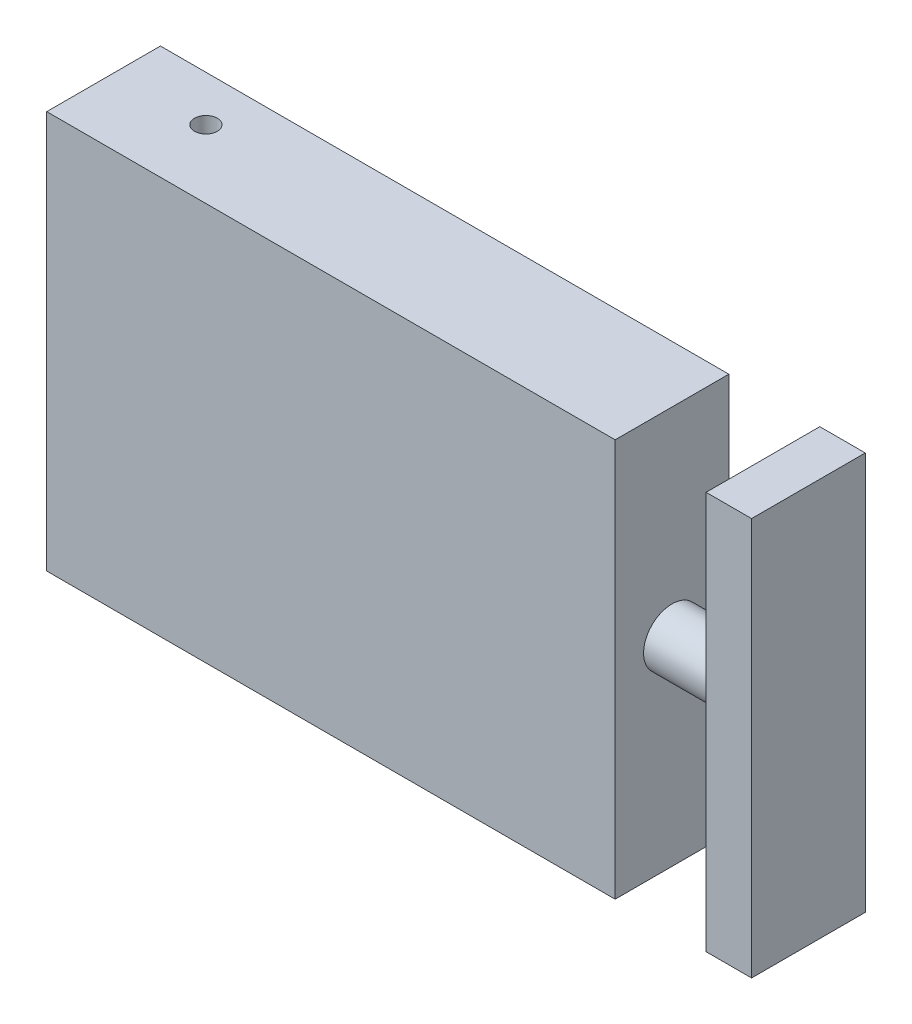
ISO-10303-21;
HEADER;
FILE_DESCRIPTION(('STEP AP214'),'2;1');
FILE_NAME('part.step','',(''),(''),'','','');
FILE_SCHEMA(('AUTOMOTIVE_DESIGN { 1 0 10303 214 1 1 1 1 }'));
ENDSEC;
DATA;
#1=APPLICATION_CONTEXT('core data for automotive mechanical design processes');
#2=APPLICATION_PROTOCOL_DEFINITION('international standard','automotive_design',2000,#1);
#3=PRODUCT_CONTEXT('',#1,'mechanical');
#4=PRODUCT('Part','Part','',(#3));
#5=PRODUCT_RELATED_PRODUCT_CATEGORY('part','',(#4));
#6=PRODUCT_DEFINITION_FORMATION('','',#4);
#7=PRODUCT_DEFINITION_CONTEXT('part definition',#1,'design');
#8=PRODUCT_DEFINITION('design','',#6,#7);
#9=PRODUCT_DEFINITION_SHAPE('','',#8);
#10=(LENGTH_UNIT() NAMED_UNIT(*) SI_UNIT(.MILLI.,.METRE.));
#11=(NAMED_UNIT(*) PLANE_ANGLE_UNIT() SI_UNIT($,.RADIAN.));
#12=(NAMED_UNIT(*) SI_UNIT($,.STERADIAN.) SOLID_ANGLE_UNIT());
#13=UNCERTAINTY_MEASURE_WITH_UNIT(LENGTH_MEASURE(1.E-05),#10,'distance_accuracy_value','');
#14=(GEOMETRIC_REPRESENTATION_CONTEXT(3) GLOBAL_UNCERTAINTY_ASSIGNED_CONTEXT((#13)) GLOBAL_UNIT_ASSIGNED_CONTEXT((#10,
#11,#12)) REPRESENTATION_CONTEXT('',''));
#15=CARTESIAN_POINT('',(0.,0.,0.));
#16=DIRECTION('',(0.,0.,1.));
#17=DIRECTION('',(1.,0.,0.));
#18=AXIS2_PLACEMENT_3D('',#15,#16,#17);
#19=CARTESIAN_POINT('',(0.,0.,100.));
#20=DIRECTION('',(1.,0.,0.));
#21=DIRECTION('',(0.,1.,0.));
#22=AXIS2_PLACEMENT_3D('',#19,#20,#21);
#23=PLANE('',#22);
#24=DIRECTION('',(0.,-1.,0.));
#25=VECTOR('',#24,1.);
#26=CARTESIAN_POINT('',(0.,0.,0.));
#27=LINE('',#26,#25);
#28=CARTESIAN_POINT('',(0.,0.,0.));
#29=VERTEX_POINT('',#28);
#30=CARTESIAN_POINT('',(0.,-350.,0.));
#31=VERTEX_POINT('',#30);
#32=EDGE_CURVE('E148',#29,#31,#27,.T.);
#33=ORIENTED_EDGE('',*,*,#32,.T.);
#34=DIRECTION('',(0.,0.,-1.));
#35=VECTOR('',#34,1.);
#36=CARTESIAN_POINT('',(0.,-350.,100.));
#37=LINE('',#36,#35);
#38=CARTESIAN_POINT('',(0.,-350.,100.));
#39=VERTEX_POINT('',#38);
#40=EDGE_CURVE('E169',#39,#31,#37,.T.);
#41=ORIENTED_EDGE('',*,*,#40,.F.);
#42=DIRECTION('',(0.,-1.,0.));
#43=VECTOR('',#42,1.);
#44=CARTESIAN_POINT('',(0.,0.,100.));
#45=LINE('',#44,#43);
#46=CARTESIAN_POINT('',(0.,0.,100.));
#47=VERTEX_POINT('',#46);
#48=EDGE_CURVE('E151',#47,#39,#45,.T.);
#49=ORIENTED_EDGE('',*,*,#48,.F.);
#50=DIRECTION('',(0.,0.,-1.));
#51=VECTOR('',#50,1.);
#52=CARTESIAN_POINT('',(0.,0.,100.));
#53=LINE('',#52,#51);
#54=EDGE_CURVE('E157',#47,#29,#53,.T.);
#55=ORIENTED_EDGE('',*,*,#54,.T.);
#56=EDGE_LOOP('',(#33,#41,#49,#55));
#57=FACE_BOUND('',#56,.T.);
#58=ADVANCED_FACE('F36',(#57),#23,.F.);
#59=CARTESIAN_POINT('',(0.,-350.,100.));
#60=DIRECTION('',(0.,1.,0.));
#61=DIRECTION('',(0.,0.,1.));
#62=AXIS2_PLACEMENT_3D('',#59,#60,#61);
#63=PLANE('',#62);
#64=CARTESIAN_POINT('',(80.,-350.,40.));
#65=DIRECTION('',(0.,-1.,0.));
#66=DIRECTION('',(0.,0.,-1.));
#67=AXIS2_PLACEMENT_3D('',#64,#65,#66);
#68=CIRCLE('',#67,10.);
#69=CARTESIAN_POINT('',(80.,-350.,30.));
#70=VERTEX_POINT('',#69);
#71=EDGE_CURVE('E139',#70,#70,#68,.T.);
#72=ORIENTED_EDGE('',*,*,#71,.F.);
#73=EDGE_LOOP('',(#72));
#74=FACE_BOUND('',#73,.T.);
#75=DIRECTION('',(1.,0.,0.));
#76=VECTOR('',#75,1.);
#77=CARTESIAN_POINT('',(0.,-350.,0.));
#78=LINE('',#77,#76);
#79=CARTESIAN_POINT('',(500.,-350.,0.));
#80=VERTEX_POINT('',#79);
#81=EDGE_CURVE('E160',#31,#80,#78,.T.);
#82=ORIENTED_EDGE('',*,*,#81,.T.);
#83=DIRECTION('',(0.,0.,-1.));
#84=VECTOR('',#83,1.);
#85=CARTESIAN_POINT('',(500.,-350.,100.));
#86=LINE('',#85,#84);
#87=CARTESIAN_POINT('',(500.,-350.,100.));
#88=VERTEX_POINT('',#87);
#89=EDGE_CURVE('E167',#88,#80,#86,.T.);
#90=ORIENTED_EDGE('',*,*,#89,.F.);
#91=DIRECTION('',(1.,0.,0.));
#92=VECTOR('',#91,1.);
#93=CARTESIAN_POINT('',(0.,-350.,100.));
#94=LINE('',#93,#92);
#95=EDGE_CURVE('E84',#39,#88,#94,.T.);
#96=ORIENTED_EDGE('',*,*,#95,.F.);
#97=ORIENTED_EDGE('',*,*,#40,.T.);
#98=EDGE_LOOP('',(#82,#90,#96,#97));
#99=FACE_BOUND('',#98,.T.);
#100=ADVANCED_FACE('F188',(#74,#99),#63,.F.);
#101=CARTESIAN_POINT('',(500.,0.,100.));
#102=DIRECTION('',(-1.,0.,0.));
#103=DIRECTION('',(0.,-1.,0.));
#104=AXIS2_PLACEMENT_3D('',#101,#102,#103);
#105=PLANE('',#104);
#106=CARTESIAN_POINT('',(500.,-175.,50.));
#107=DIRECTION('',(-1.,0.,0.));
#108=DIRECTION('',(0.,-1.,0.));
#109=AXIS2_PLACEMENT_3D('',#106,#107,#108);
#110=CIRCLE('',#109,25.);
#111=CARTESIAN_POINT('',(500.,-200.,50.));
#112=VERTEX_POINT('',#111);
#113=EDGE_CURVE('E11',#112,#112,#110,.F.);
#114=ORIENTED_EDGE('',*,*,#113,.F.);
#115=EDGE_LOOP('',(#114));
#116=FACE_BOUND('',#115,.T.);
#117=DIRECTION('',(0.,1.,0.));
#118=VECTOR('',#117,1.);
#119=CARTESIAN_POINT('',(500.,0.,0.));
#120=LINE('',#119,#118);
#121=CARTESIAN_POINT('',(500.,0.,0.));
#122=VERTEX_POINT('',#121);
#123=EDGE_CURVE('E70',#80,#122,#120,.T.);
#124=ORIENTED_EDGE('',*,*,#123,.T.);
#125=DIRECTION('',(0.,0.,-1.));
#126=VECTOR('',#125,1.);
#127=CARTESIAN_POINT('',(500.,0.,100.));
#128=LINE('',#127,#126);
#129=CARTESIAN_POINT('',(500.,0.,100.));
#130=VERTEX_POINT('',#129);
#131=EDGE_CURVE('E165',#130,#122,#128,.T.);
#132=ORIENTED_EDGE('',*,*,#131,.F.);
#133=DIRECTION('',(0.,1.,0.));
#134=VECTOR('',#133,1.);
#135=CARTESIAN_POINT('',(500.,0.,100.));
#136=LINE('',#135,#134);
#137=EDGE_CURVE('E154',#88,#130,#136,.T.);
#138=ORIENTED_EDGE('',*,*,#137,.F.);
#139=ORIENTED_EDGE('',*,*,#89,.T.);
#140=EDGE_LOOP('',(#124,#132,#138,#139));
#141=FACE_BOUND('',#140,.T.);
#142=ADVANCED_FACE('F187',(#116,#141),#105,.F.);
#143=CARTESIAN_POINT('',(0.,0.,100.));
#144=DIRECTION('',(0.,-1.,0.));
#145=DIRECTION('',(0.,0.,-1.));
#146=AXIS2_PLACEMENT_3D('',#143,#144,#145);
#147=PLANE('',#146);
#148=CARTESIAN_POINT('',(80.,0.,40.));
#149=DIRECTION('',(0.,-1.,0.));
#150=DIRECTION('',(0.,0.,-1.));
#151=AXIS2_PLACEMENT_3D('',#148,#149,#150);
#152=CIRCLE('',#151,10.);
#153=CARTESIAN_POINT('',(80.,0.,30.));
#154=VERTEX_POINT('',#153);
#155=EDGE_CURVE('E145',#154,#154,#152,.T.);
#156=ORIENTED_EDGE('',*,*,#155,.T.);
#157=EDGE_LOOP('',(#156));
#158=FACE_BOUND('',#157,.T.);
#159=DIRECTION('',(-1.,0.,0.));
#160=VECTOR('',#159,1.);
#161=CARTESIAN_POINT('',(0.,0.,0.));
#162=LINE('',#161,#160);
#163=EDGE_CURVE('E76',#122,#29,#162,.T.);
#164=ORIENTED_EDGE('',*,*,#163,.T.);
#165=ORIENTED_EDGE('',*,*,#54,.F.);
#166=DIRECTION('',(-1.,0.,0.));
#167=VECTOR('',#166,1.);
#168=CARTESIAN_POINT('',(0.,0.,100.));
#169=LINE('',#168,#167);
#170=EDGE_CURVE('E52',#130,#47,#169,.T.);
#171=ORIENTED_EDGE('',*,*,#170,.F.);
#172=ORIENTED_EDGE('',*,*,#131,.T.);
#173=EDGE_LOOP('',(#164,#165,#171,#172));
#174=FACE_BOUND('',#173,.T.);
#175=ADVANCED_FACE('F185',(#158,#174),#147,.F.);
#176=CARTESIAN_POINT('',(0.,0.,100.));
#177=DIRECTION('',(0.,0.,1.));
#178=DIRECTION('',(1.,0.,0.));
#179=AXIS2_PLACEMENT_3D('',#176,#177,#178);
#180=PLANE('',#179);
#181=ORIENTED_EDGE('',*,*,#48,.T.);
#182=ORIENTED_EDGE('',*,*,#95,.T.);
#183=ORIENTED_EDGE('',*,*,#137,.T.);
#184=ORIENTED_EDGE('',*,*,#170,.T.);
#185=EDGE_LOOP('',(#181,#182,#183,#184));
#186=FACE_BOUND('',#185,.T.);
#187=ADVANCED_FACE('F179',(#186),#180,.T.);
#188=CARTESIAN_POINT('',(0.,0.,0.));
#189=DIRECTION('',(0.,0.,1.));
#190=DIRECTION('',(1.,0.,0.));
#191=AXIS2_PLACEMENT_3D('',#188,#189,#190);
#192=PLANE('',#191);
#193=CARTESIAN_POINT('',(380.,-175.,0.));
#194=DIRECTION('',(0.,0.,1.));
#195=DIRECTION('',(1.,0.,0.));
#196=AXIS2_PLACEMENT_3D('',#193,#194,#195);
#197=CIRCLE('',#196,60.);
#198=CARTESIAN_POINT('',(440.,-175.,0.));
#199=VERTEX_POINT('',#198);
#200=EDGE_CURVE('E44',#199,#199,#197,.F.);
#201=ORIENTED_EDGE('',*,*,#200,.F.);
#202=EDGE_LOOP('',(#201));
#203=FACE_BOUND('',#202,.T.);
#204=ORIENTED_EDGE('',*,*,#32,.F.);
#205=ORIENTED_EDGE('',*,*,#163,.F.);
#206=ORIENTED_EDGE('',*,*,#123,.F.);
#207=ORIENTED_EDGE('',*,*,#81,.F.);
#208=EDGE_LOOP('',(#204,#205,#206,#207));
#209=FACE_BOUND('',#208,.T.);
#210=ADVANCED_FACE('F175',(#203,#209),#192,.F.);
#211=CARTESIAN_POINT('',(80.,0.,40.));
#212=DIRECTION('',(0.,-1.,0.));
#213=DIRECTION('',(0.,0.,-1.));
#214=AXIS2_PLACEMENT_3D('',#211,#212,#213);
#215=CYLINDRICAL_SURFACE('',#214,10.);
#216=ORIENTED_EDGE('',*,*,#155,.F.);
#217=EDGE_LOOP('',(#216));
#218=FACE_BOUND('',#217,.T.);
#219=ORIENTED_EDGE('',*,*,#71,.T.);
#220=EDGE_LOOP('',(#219));
#221=FACE_BOUND('',#220,.T.);
#222=ADVANCED_FACE('F178',(#218,#221),#215,.F.);
#223=CARTESIAN_POINT('',(380.,-175.,0.));
#224=DIRECTION('',(-1.,0.,0.));
#225=DIRECTION('',(0.,1.,0.));
#226=AXIS2_PLACEMENT_3D('',#223,#224,#225);
#227=SPHERICAL_SURFACE('',#226,60.);
#228=CARTESIAN_POINT('',(380.,-175.,0.));
#229=DIRECTION('',(0.,0.,1.));
#230=DIRECTION('',(1.,0.,0.));
#231=AXIS2_PLACEMENT_3D('',#228,#229,#230);
#232=SPHERICAL_SURFACE('',#231,60.);
#233=ORIENTED_EDGE('',*,*,#200,.T.);
#234=EDGE_LOOP('',(#233));
#235=FACE_BOUND('',#234,.T.);
#236=ADVANCED_FACE('F173',(#235),#232,.T.);
#237=CARTESIAN_POINT('',(580.,-175.,50.));
#238=DIRECTION('',(-1.,0.,0.));
#239=DIRECTION('',(0.,-1.,0.));
#240=AXIS2_PLACEMENT_3D('',#237,#238,#239);
#241=CYLINDRICAL_SURFACE('',#240,25.);
#242=CARTESIAN_POINT('',(580.,-175.,50.));
#243=DIRECTION('',(1.,0.,0.));
#244=DIRECTION('',(0.,1.,0.));
#245=AXIS2_PLACEMENT_3D('',#242,#243,#244);
#246=CIRCLE('',#245,25.);
#247=CARTESIAN_POINT('',(580.,-150.,50.));
#248=VERTEX_POINT('',#247);
#249=EDGE_CURVE('E136',#248,#248,#246,.T.);
#250=ORIENTED_EDGE('',*,*,#249,.F.);
#251=EDGE_LOOP('',(#250));
#252=FACE_BOUND('',#251,.T.);
#253=ORIENTED_EDGE('',*,*,#113,.T.);
#254=EDGE_LOOP('',(#253));
#255=FACE_BOUND('',#254,.T.);
#256=ADVANCED_FACE('F209',(#252,#255),#241,.T.);
#257=CARTESIAN_POINT('',(620.,-350.,100.));
#258=DIRECTION('',(0.,0.,-1.));
#259=DIRECTION('',(-1.,0.,0.));
#260=AXIS2_PLACEMENT_3D('',#257,#258,#259);
#261=PLANE('',#260);
#262=DIRECTION('',(0.,-1.,0.));
#263=VECTOR('',#262,1.);
#264=CARTESIAN_POINT('',(580.,-350.,100.));
#265=LINE('',#264,#263);
#266=CARTESIAN_POINT('',(580.,0.,100.));
#267=VERTEX_POINT('',#266);
#268=CARTESIAN_POINT('',(580.,-350.,100.));
#269=VERTEX_POINT('',#268);
#270=EDGE_CURVE('E135',#267,#269,#265,.T.);
#271=ORIENTED_EDGE('',*,*,#270,.T.);
#272=DIRECTION('',(-1.,0.,0.));
#273=VECTOR('',#272,1.);
#274=CARTESIAN_POINT('',(620.,-350.,100.));
#275=LINE('',#274,#273);
#276=CARTESIAN_POINT('',(620.,-350.,100.));
#277=VERTEX_POINT('',#276);
#278=EDGE_CURVE('E115',#277,#269,#275,.T.);
#279=ORIENTED_EDGE('',*,*,#278,.F.);
#280=DIRECTION('',(0.,-1.,0.));
#281=VECTOR('',#280,1.);
#282=CARTESIAN_POINT('',(620.,-350.,100.));
#283=LINE('',#282,#281);
#284=CARTESIAN_POINT('',(620.,0.,100.));
#285=VERTEX_POINT('',#284);
#286=EDGE_CURVE('E122',#285,#277,#283,.T.);
#287=ORIENTED_EDGE('',*,*,#286,.F.);
#288=DIRECTION('',(-1.,0.,0.));
#289=VECTOR('',#288,1.);
#290=CARTESIAN_POINT('',(620.,0.,100.));
#291=LINE('',#290,#289);
#292=EDGE_CURVE('E331',#285,#267,#291,.T.);
#293=ORIENTED_EDGE('',*,*,#292,.T.);
#294=EDGE_LOOP('',(#271,#279,#287,#293));
#295=FACE_BOUND('',#294,.T.);
#296=ADVANCED_FACE('F133',(#295),#261,.F.);
#297=CARTESIAN_POINT('',(620.,-350.,0.));
#298=DIRECTION('',(0.,1.,0.));
#299=DIRECTION('',(-1.,0.,0.));
#300=AXIS2_PLACEMENT_3D('',#297,#298,#299);
#301=PLANE('',#300);
#302=DIRECTION('',(0.,0.,-1.));
#303=VECTOR('',#302,1.);
#304=CARTESIAN_POINT('',(580.,-350.,0.));
#305=LINE('',#304,#303);
#306=CARTESIAN_POINT('',(580.,-350.,0.));
#307=VERTEX_POINT('',#306);
#308=EDGE_CURVE('E322',#269,#307,#305,.T.);
#309=ORIENTED_EDGE('',*,*,#308,.T.);
#310=DIRECTION('',(-1.,0.,0.));
#311=VECTOR('',#310,1.);
#312=CARTESIAN_POINT('',(620.,-350.,0.));
#313=LINE('',#312,#311);
#314=CARTESIAN_POINT('',(620.,-350.,0.));
#315=VERTEX_POINT('',#314);
#316=EDGE_CURVE('E118',#315,#307,#313,.T.);
#317=ORIENTED_EDGE('',*,*,#316,.F.);
#318=DIRECTION('',(0.,0.,-1.));
#319=VECTOR('',#318,1.);
#320=CARTESIAN_POINT('',(620.,-350.,0.));
#321=LINE('',#320,#319);
#322=EDGE_CURVE('E111',#277,#315,#321,.T.);
#323=ORIENTED_EDGE('',*,*,#322,.F.);
#324=ORIENTED_EDGE('',*,*,#278,.T.);
#325=EDGE_LOOP('',(#309,#317,#323,#324));
#326=FACE_BOUND('',#325,.T.);
#327=ADVANCED_FACE('F113',(#326),#301,.F.);
#328=CARTESIAN_POINT('',(620.,-350.,0.));
#329=DIRECTION('',(0.,0.,1.));
#330=DIRECTION('',(1.,0.,0.));
#331=AXIS2_PLACEMENT_3D('',#328,#329,#330);
#332=PLANE('',#331);
#333=DIRECTION('',(0.,1.,0.));
#334=VECTOR('',#333,1.);
#335=CARTESIAN_POINT('',(580.,-350.,0.));
#336=LINE('',#335,#334);
#337=CARTESIAN_POINT('',(580.,0.,0.));
#338=VERTEX_POINT('',#337);
#339=EDGE_CURVE('E324',#307,#338,#336,.T.);
#340=ORIENTED_EDGE('',*,*,#339,.T.);
#341=DIRECTION('',(-1.,0.,0.));
#342=VECTOR('',#341,1.);
#343=CARTESIAN_POINT('',(620.,0.,0.));
#344=LINE('',#343,#342);
#345=CARTESIAN_POINT('',(620.,0.,0.));
#346=VERTEX_POINT('',#345);
#347=EDGE_CURVE('E141',#346,#338,#344,.T.);
#348=ORIENTED_EDGE('',*,*,#347,.F.);
#349=DIRECTION('',(0.,1.,0.));
#350=VECTOR('',#349,1.);
#351=CARTESIAN_POINT('',(620.,-350.,0.));
#352=LINE('',#351,#350);
#353=EDGE_CURVE('E121',#315,#346,#352,.T.);
#354=ORIENTED_EDGE('',*,*,#353,.F.);
#355=ORIENTED_EDGE('',*,*,#316,.T.);
#356=EDGE_LOOP('',(#340,#348,#354,#355));
#357=FACE_BOUND('',#356,.T.);
#358=ADVANCED_FACE('F217',(#357),#332,.F.);
#359=CARTESIAN_POINT('',(620.,0.,0.));
#360=DIRECTION('',(0.,-1.,0.));
#361=DIRECTION('',(1.,0.,0.));
#362=AXIS2_PLACEMENT_3D('',#359,#360,#361);
#363=PLANE('',#362);
#364=DIRECTION('',(0.,0.,1.));
#365=VECTOR('',#364,1.);
#366=CARTESIAN_POINT('',(580.,0.,0.));
#367=LINE('',#366,#365);
#368=EDGE_CURVE('E131',#338,#267,#367,.T.);
#369=ORIENTED_EDGE('',*,*,#368,.T.);
#370=ORIENTED_EDGE('',*,*,#292,.F.);
#371=DIRECTION('',(0.,0.,1.));
#372=VECTOR('',#371,1.);
#373=CARTESIAN_POINT('',(620.,0.,0.));
#374=LINE('',#373,#372);
#375=EDGE_CURVE('E127',#346,#285,#374,.T.);
#376=ORIENTED_EDGE('',*,*,#375,.F.);
#377=ORIENTED_EDGE('',*,*,#347,.T.);
#378=EDGE_LOOP('',(#369,#370,#376,#377));
#379=FACE_BOUND('',#378,.T.);
#380=ADVANCED_FACE('F220',(#379),#363,.F.);
#381=CARTESIAN_POINT('',(620.,1.96668078647885E-13,0.));
#382=DIRECTION('',(1.,0.,0.));
#383=DIRECTION('',(0.,1.,0.));
#384=AXIS2_PLACEMENT_3D('',#381,#382,#383);
#385=PLANE('',#384);
#386=ORIENTED_EDGE('',*,*,#286,.T.);
#387=ORIENTED_EDGE('',*,*,#322,.T.);
#388=ORIENTED_EDGE('',*,*,#353,.T.);
#389=ORIENTED_EDGE('',*,*,#375,.T.);
#390=EDGE_LOOP('',(#386,#387,#388,#389));
#391=FACE_BOUND('',#390,.T.);
#392=ADVANCED_FACE('F125',(#391),#385,.T.);
#393=CARTESIAN_POINT('',(580.,1.83979815509312E-13,0.));
#394=DIRECTION('',(1.,0.,0.));
#395=DIRECTION('',(0.,1.,0.));
#396=AXIS2_PLACEMENT_3D('',#393,#394,#395);
#397=PLANE('',#396);
#398=ORIENTED_EDGE('',*,*,#249,.T.);
#399=EDGE_LOOP('',(#398));
#400=FACE_BOUND('',#399,.T.);
#401=ORIENTED_EDGE('',*,*,#270,.F.);
#402=ORIENTED_EDGE('',*,*,#368,.F.);
#403=ORIENTED_EDGE('',*,*,#339,.F.);
#404=ORIENTED_EDGE('',*,*,#308,.F.);
#405=EDGE_LOOP('',(#401,#402,#403,#404));
#406=FACE_BOUND('',#405,.T.);
#407=ADVANCED_FACE('F225',(#400,#406),#397,.F.);
#408=CLOSED_SHELL('',(#58,#100,#142,#175,#187,#210,#222,#236,#256,#296,#327,#358,#380,#392,#407));
#409=MANIFOLD_SOLID_BREP('B2',#408);
#410=ADVANCED_BREP_SHAPE_REPRESENTATION('',(#18,#409),#14);
#411=SHAPE_DEFINITION_REPRESENTATION(#9,#410);
ENDSEC;
END-ISO-10303-21;
